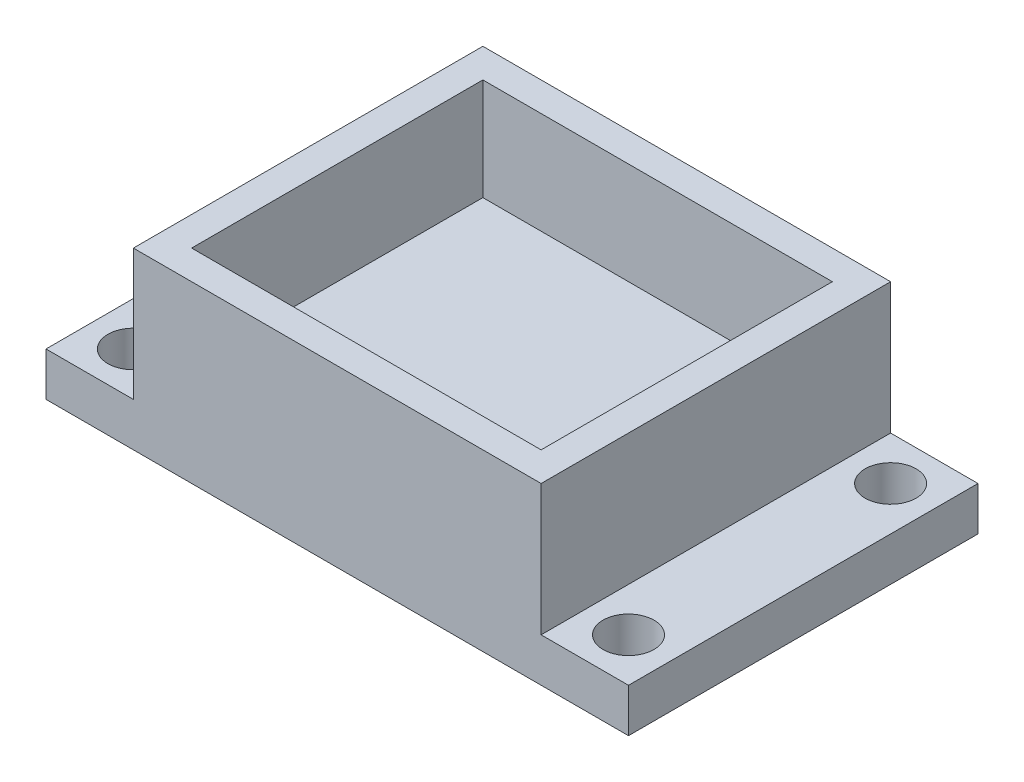
ISO-10303-21;
HEADER;
FILE_DESCRIPTION(('STEP AP214'),'2;1');
FILE_NAME('part.step','',(''),(''),'','','');
FILE_SCHEMA(('AUTOMOTIVE_DESIGN { 1 0 10303 214 1 1 1 1 }'));
ENDSEC;
DATA;
#1=APPLICATION_CONTEXT('core data for automotive mechanical design processes');
#2=APPLICATION_PROTOCOL_DEFINITION('international standard','automotive_design',2000,#1);
#3=PRODUCT_CONTEXT('',#1,'mechanical');
#4=PRODUCT('Part','Part','',(#3));
#5=PRODUCT_RELATED_PRODUCT_CATEGORY('part','',(#4));
#6=PRODUCT_DEFINITION_FORMATION('','',#4);
#7=PRODUCT_DEFINITION_CONTEXT('part definition',#1,'design');
#8=PRODUCT_DEFINITION('design','',#6,#7);
#9=PRODUCT_DEFINITION_SHAPE('','',#8);
#10=(LENGTH_UNIT() NAMED_UNIT(*) SI_UNIT(.MILLI.,.METRE.));
#11=(NAMED_UNIT(*) PLANE_ANGLE_UNIT() SI_UNIT($,.RADIAN.));
#12=(NAMED_UNIT(*) SI_UNIT($,.STERADIAN.) SOLID_ANGLE_UNIT());
#13=UNCERTAINTY_MEASURE_WITH_UNIT(LENGTH_MEASURE(1.E-05),#10,'distance_accuracy_value','');
#14=(GEOMETRIC_REPRESENTATION_CONTEXT(3) GLOBAL_UNCERTAINTY_ASSIGNED_CONTEXT((#13)) GLOBAL_UNIT_ASSIGNED_CONTEXT((#10,
#11,#12)) REPRESENTATION_CONTEXT('',''));
#15=CARTESIAN_POINT('',(0.,0.,0.));
#16=DIRECTION('',(0.,0.,1.));
#17=DIRECTION('',(1.,0.,0.));
#18=AXIS2_PLACEMENT_3D('',#15,#16,#17);
#19=CARTESIAN_POINT('',(9.5,5.,7.5));
#20=DIRECTION('',(0.,1.,0.));
#21=DIRECTION('',(0.,0.,1.));
#22=AXIS2_PLACEMENT_3D('',#19,#20,#21);
#23=CYLINDRICAL_SURFACE('',#22,1.15000000000001);
#24=CARTESIAN_POINT('',(9.5,5.,7.5));
#25=DIRECTION('',(0.,1.,0.));
#26=DIRECTION('',(0.,0.,1.));
#27=AXIS2_PLACEMENT_3D('',#24,#25,#26);
#28=CIRCLE('',#27,1.15000000000001);
#29=CARTESIAN_POINT('',(9.5,5.,8.65000000000001));
#30=VERTEX_POINT('',#29);
#31=EDGE_CURVE('E359',#30,#30,#28,.T.);
#32=ORIENTED_EDGE('',*,*,#31,.T.);
#33=EDGE_LOOP('',(#32));
#34=FACE_BOUND('',#33,.T.);
#35=CARTESIAN_POINT('',(9.5,3.2,7.5));
#36=DIRECTION('',(0.,-1.,0.));
#37=DIRECTION('',(0.,0.,-1.));
#38=AXIS2_PLACEMENT_3D('',#35,#36,#37);
#39=CIRCLE('',#38,1.15000000000001);
#40=CARTESIAN_POINT('',(9.5,3.2,6.34999999999999));
#41=VERTEX_POINT('',#40);
#42=EDGE_CURVE('E42',#41,#41,#39,.F.);
#43=ORIENTED_EDGE('',*,*,#42,.F.);
#44=EDGE_LOOP('',(#43));
#45=FACE_BOUND('',#44,.T.);
#46=ADVANCED_FACE('F38',(#34,#45),#23,.F.);
#47=CARTESIAN_POINT('',(9.5,5.,-7.5));
#48=DIRECTION('',(0.,1.,0.));
#49=DIRECTION('',(0.,0.,1.));
#50=AXIS2_PLACEMENT_3D('',#47,#48,#49);
#51=CYLINDRICAL_SURFACE('',#50,1.15000000000001);
#52=CARTESIAN_POINT('',(9.5,5.,-7.5));
#53=DIRECTION('',(0.,1.,0.));
#54=DIRECTION('',(0.,0.,1.));
#55=AXIS2_PLACEMENT_3D('',#52,#53,#54);
#56=CIRCLE('',#55,1.15000000000001);
#57=CARTESIAN_POINT('',(9.5,5.,-6.34999999999999));
#58=VERTEX_POINT('',#57);
#59=EDGE_CURVE('E350',#58,#58,#56,.T.);
#60=ORIENTED_EDGE('',*,*,#59,.T.);
#61=EDGE_LOOP('',(#60));
#62=FACE_BOUND('',#61,.T.);
#63=CARTESIAN_POINT('',(9.5,3.2,-7.5));
#64=DIRECTION('',(0.,-1.,0.));
#65=DIRECTION('',(0.,0.,-1.));
#66=AXIS2_PLACEMENT_3D('',#63,#64,#65);
#67=CIRCLE('',#66,1.15000000000001);
#68=CARTESIAN_POINT('',(9.5,3.2,-8.65000000000001));
#69=VERTEX_POINT('',#68);
#70=EDGE_CURVE('E273',#69,#69,#67,.F.);
#71=ORIENTED_EDGE('',*,*,#70,.F.);
#72=EDGE_LOOP('',(#71));
#73=FACE_BOUND('',#72,.T.);
#74=ADVANCED_FACE('F483',(#62,#73),#51,.F.);
#75=CARTESIAN_POINT('',(-20.,3.,-12.));
#76=DIRECTION('',(0.,-1.,0.));
#77=DIRECTION('',(0.,0.,-1.));
#78=AXIS2_PLACEMENT_3D('',#75,#76,#77);
#79=PLANE('',#78);
#80=DIRECTION('',(0.,0.,-1.));
#81=VECTOR('',#80,1.);
#82=CARTESIAN_POINT('',(-14.,3.,-12.));
#83=LINE('',#82,#81);
#84=CARTESIAN_POINT('',(-14.,3.,12.));
#85=VERTEX_POINT('',#84);
#86=CARTESIAN_POINT('',(-14.,3.,-12.));
#87=VERTEX_POINT('',#86);
#88=EDGE_CURVE('E405',#85,#87,#83,.T.);
#89=ORIENTED_EDGE('',*,*,#88,.T.);
#90=DIRECTION('',(1.,0.,0.));
#91=VECTOR('',#90,1.);
#92=CARTESIAN_POINT('',(-20.,3.,-12.));
#93=LINE('',#92,#91);
#94=CARTESIAN_POINT('',(-20.,3.,-12.));
#95=VERTEX_POINT('',#94);
#96=EDGE_CURVE('E416',#95,#87,#93,.T.);
#97=ORIENTED_EDGE('',*,*,#96,.F.);
#98=DIRECTION('',(0.,0.,-1.));
#99=VECTOR('',#98,1.);
#100=CARTESIAN_POINT('',(-20.,3.,-12.));
#101=LINE('',#100,#99);
#102=CARTESIAN_POINT('',(-20.,3.,12.));
#103=VERTEX_POINT('',#102);
#104=EDGE_CURVE('E414',#103,#95,#101,.T.);
#105=ORIENTED_EDGE('',*,*,#104,.F.);
#106=DIRECTION('',(1.,0.,0.));
#107=VECTOR('',#106,1.);
#108=CARTESIAN_POINT('',(-20.,3.,12.));
#109=LINE('',#108,#107);
#110=EDGE_CURVE('E421',#103,#85,#109,.T.);
#111=ORIENTED_EDGE('',*,*,#110,.T.);
#112=EDGE_LOOP('',(#89,#97,#105,#111));
#113=FACE_BOUND('',#112,.T.);
#114=CARTESIAN_POINT('',(-17.,3.,9.));
#115=DIRECTION('',(0.,1.,0.));
#116=DIRECTION('',(0.,0.,1.));
#117=AXIS2_PLACEMENT_3D('',#114,#115,#116);
#118=CIRCLE('',#117,1.75000000000001);
#119=CARTESIAN_POINT('',(-17.,3.,10.75));
#120=VERTEX_POINT('',#119);
#121=EDGE_CURVE('E399',#120,#120,#118,.T.);
#122=ORIENTED_EDGE('',*,*,#121,.F.);
#123=EDGE_LOOP('',(#122));
#124=FACE_BOUND('',#123,.T.);
#125=CARTESIAN_POINT('',(-17.,3.,-9.00000000000001));
#126=DIRECTION('',(0.,1.,0.));
#127=DIRECTION('',(0.,0.,1.));
#128=AXIS2_PLACEMENT_3D('',#125,#126,#127);
#129=CIRCLE('',#128,1.75000000000001);
#130=CARTESIAN_POINT('',(-17.,3.,-7.24999999999999));
#131=VERTEX_POINT('',#130);
#132=EDGE_CURVE('E393',#131,#131,#129,.T.);
#133=ORIENTED_EDGE('',*,*,#132,.F.);
#134=EDGE_LOOP('',(#133));
#135=FACE_BOUND('',#134,.T.);
#136=ADVANCED_FACE('F490',(#113,#124,#135),#79,.F.);
#137=CARTESIAN_POINT('',(-14.,12.,-12.));
#138=DIRECTION('',(1.,0.,0.));
#139=DIRECTION('',(0.,0.,-1.));
#140=AXIS2_PLACEMENT_3D('',#137,#138,#139);
#141=PLANE('',#140);
#142=ORIENTED_EDGE('',*,*,#88,.F.);
#143=DIRECTION('',(0.,-1.,0.));
#144=VECTOR('',#143,1.);
#145=CARTESIAN_POINT('',(-14.,12.,12.));
#146=LINE('',#145,#144);
#147=CARTESIAN_POINT('',(-14.,12.,12.));
#148=VERTEX_POINT('',#147);
#149=EDGE_CURVE('E473',#148,#85,#146,.T.);
#150=ORIENTED_EDGE('',*,*,#149,.F.);
#151=DIRECTION('',(0.,0.,1.));
#152=VECTOR('',#151,1.);
#153=CARTESIAN_POINT('',(-14.,12.,-12.));
#154=LINE('',#153,#152);
#155=CARTESIAN_POINT('',(-14.,12.,-12.));
#156=VERTEX_POINT('',#155);
#157=EDGE_CURVE('E464',#156,#148,#154,.T.);
#158=ORIENTED_EDGE('',*,*,#157,.F.);
#159=DIRECTION('',(0.,-1.,0.));
#160=VECTOR('',#159,1.);
#161=CARTESIAN_POINT('',(-14.,12.,-12.));
#162=LINE('',#161,#160);
#163=EDGE_CURVE('E47',#156,#87,#162,.T.);
#164=ORIENTED_EDGE('',*,*,#163,.T.);
#165=EDGE_LOOP('',(#142,#150,#158,#164));
#166=FACE_BOUND('',#165,.T.);
#167=ADVANCED_FACE('F527',(#166),#141,.F.);
#168=CARTESIAN_POINT('',(14.,12.,-12.));
#169=DIRECTION('',(-1.,0.,0.));
#170=DIRECTION('',(0.,0.,1.));
#171=AXIS2_PLACEMENT_3D('',#168,#169,#170);
#172=PLANE('',#171);
#173=DIRECTION('',(0.,-1.,0.));
#174=VECTOR('',#173,1.);
#175=CARTESIAN_POINT('',(14.,12.,12.));
#176=LINE('',#175,#174);
#177=CARTESIAN_POINT('',(14.,12.,12.));
#178=VERTEX_POINT('',#177);
#179=CARTESIAN_POINT('',(14.,3.,12.));
#180=VERTEX_POINT('',#179);
#181=EDGE_CURVE('E468',#178,#180,#176,.T.);
#182=ORIENTED_EDGE('',*,*,#181,.T.);
#183=DIRECTION('',(0.,0.,-1.));
#184=VECTOR('',#183,1.);
#185=CARTESIAN_POINT('',(14.,3.,-12.));
#186=LINE('',#185,#184);
#187=CARTESIAN_POINT('',(14.,3.,-12.));
#188=VERTEX_POINT('',#187);
#189=EDGE_CURVE('E374',#180,#188,#186,.T.);
#190=ORIENTED_EDGE('',*,*,#189,.T.);
#191=DIRECTION('',(0.,-1.,0.));
#192=VECTOR('',#191,1.);
#193=CARTESIAN_POINT('',(14.,12.,-12.));
#194=LINE('',#193,#192);
#195=CARTESIAN_POINT('',(14.,12.,-12.));
#196=VERTEX_POINT('',#195);
#197=EDGE_CURVE('E11',#196,#188,#194,.T.);
#198=ORIENTED_EDGE('',*,*,#197,.F.);
#199=DIRECTION('',(0.,0.,-1.));
#200=VECTOR('',#199,1.);
#201=CARTESIAN_POINT('',(14.,12.,-12.));
#202=LINE('',#201,#200);
#203=EDGE_CURVE('E458',#178,#196,#202,.T.);
#204=ORIENTED_EDGE('',*,*,#203,.F.);
#205=EDGE_LOOP('',(#182,#190,#198,#204));
#206=FACE_BOUND('',#205,.T.);
#207=ADVANCED_FACE('F40',(#206),#172,.F.);
#208=CARTESIAN_POINT('',(-14.,12.,-12.));
#209=DIRECTION('',(0.,0.,1.));
#210=DIRECTION('',(1.,0.,0.));
#211=AXIS2_PLACEMENT_3D('',#208,#209,#210);
#212=PLANE('',#211);
#213=DIRECTION('',(-1.,0.,0.));
#214=VECTOR('',#213,1.);
#215=CARTESIAN_POINT('',(-14.,0.,-12.));
#216=LINE('',#215,#214);
#217=CARTESIAN_POINT('',(20.,0.,-12.));
#218=VERTEX_POINT('',#217);
#219=CARTESIAN_POINT('',(-20.,0.,-12.));
#220=VERTEX_POINT('',#219);
#221=EDGE_CURVE('E451',#218,#220,#216,.T.);
#222=ORIENTED_EDGE('',*,*,#221,.T.);
#223=DIRECTION('',(0.,-1.,0.));
#224=VECTOR('',#223,1.);
#225=CARTESIAN_POINT('',(-20.,0.,-12.));
#226=LINE('',#225,#224);
#227=EDGE_CURVE('E406',#95,#220,#226,.T.);
#228=ORIENTED_EDGE('',*,*,#227,.F.);
#229=ORIENTED_EDGE('',*,*,#96,.T.);
#230=ORIENTED_EDGE('',*,*,#163,.F.);
#231=DIRECTION('',(-1.,0.,0.));
#232=VECTOR('',#231,1.);
#233=CARTESIAN_POINT('',(-14.,12.,-12.));
#234=LINE('',#233,#232);
#235=EDGE_CURVE('E461',#196,#156,#234,.T.);
#236=ORIENTED_EDGE('',*,*,#235,.F.);
#237=ORIENTED_EDGE('',*,*,#197,.T.);
#238=DIRECTION('',(-1.,0.,0.));
#239=VECTOR('',#238,1.);
#240=CARTESIAN_POINT('',(20.,3.,-12.));
#241=LINE('',#240,#239);
#242=CARTESIAN_POINT('',(20.,3.,-12.));
#243=VERTEX_POINT('',#242);
#244=EDGE_CURVE('E391',#243,#188,#241,.T.);
#245=ORIENTED_EDGE('',*,*,#244,.F.);
#246=DIRECTION('',(0.,-1.,0.));
#247=VECTOR('',#246,1.);
#248=CARTESIAN_POINT('',(20.,0.,-12.));
#249=LINE('',#248,#247);
#250=EDGE_CURVE('E375',#243,#218,#249,.T.);
#251=ORIENTED_EDGE('',*,*,#250,.T.);
#252=EDGE_LOOP('',(#222,#228,#229,#230,#236,#237,#245,#251));
#253=FACE_BOUND('',#252,.T.);
#254=ADVANCED_FACE('F559',(#253),#212,.F.);
#255=CARTESIAN_POINT('',(-14.,12.,12.));
#256=DIRECTION('',(0.,0.,-1.));
#257=DIRECTION('',(-1.,0.,0.));
#258=AXIS2_PLACEMENT_3D('',#255,#256,#257);
#259=PLANE('',#258);
#260=DIRECTION('',(1.,0.,0.));
#261=VECTOR('',#260,1.);
#262=CARTESIAN_POINT('',(-14.,0.,12.));
#263=LINE('',#262,#261);
#264=CARTESIAN_POINT('',(-20.,0.,12.));
#265=VERTEX_POINT('',#264);
#266=CARTESIAN_POINT('',(20.,0.,12.));
#267=VERTEX_POINT('',#266);
#268=EDGE_CURVE('E462',#265,#267,#263,.T.);
#269=ORIENTED_EDGE('',*,*,#268,.T.);
#270=DIRECTION('',(0.,1.,0.));
#271=VECTOR('',#270,1.);
#272=CARTESIAN_POINT('',(20.,0.,12.));
#273=LINE('',#272,#271);
#274=CARTESIAN_POINT('',(20.,3.,12.));
#275=VERTEX_POINT('',#274);
#276=EDGE_CURVE('E381',#267,#275,#273,.T.);
#277=ORIENTED_EDGE('',*,*,#276,.T.);
#278=DIRECTION('',(-1.,0.,0.));
#279=VECTOR('',#278,1.);
#280=CARTESIAN_POINT('',(20.,3.,12.));
#281=LINE('',#280,#279);
#282=EDGE_CURVE('E387',#275,#180,#281,.T.);
#283=ORIENTED_EDGE('',*,*,#282,.T.);
#284=ORIENTED_EDGE('',*,*,#181,.F.);
#285=DIRECTION('',(1.,0.,0.));
#286=VECTOR('',#285,1.);
#287=CARTESIAN_POINT('',(-14.,12.,12.));
#288=LINE('',#287,#286);
#289=EDGE_CURVE('E466',#148,#178,#288,.T.);
#290=ORIENTED_EDGE('',*,*,#289,.F.);
#291=ORIENTED_EDGE('',*,*,#149,.T.);
#292=ORIENTED_EDGE('',*,*,#110,.F.);
#293=DIRECTION('',(0.,1.,0.));
#294=VECTOR('',#293,1.);
#295=CARTESIAN_POINT('',(-20.,0.,12.));
#296=LINE('',#295,#294);
#297=EDGE_CURVE('E412',#265,#103,#296,.T.);
#298=ORIENTED_EDGE('',*,*,#297,.F.);
#299=EDGE_LOOP('',(#269,#277,#283,#284,#290,#291,#292,#298));
#300=FACE_BOUND('',#299,.T.);
#301=ADVANCED_FACE('F552',(#300),#259,.F.);
#302=CARTESIAN_POINT('',(0.,12.,0.));
#303=DIRECTION('',(0.,1.,0.));
#304=DIRECTION('',(0.,0.,1.));
#305=AXIS2_PLACEMENT_3D('',#302,#303,#304);
#306=PLANE('',#305);
#307=DIRECTION('',(0.,0.,-1.));
#308=VECTOR('',#307,1.);
#309=CARTESIAN_POINT('',(12.,12.,-10.));
#310=LINE('',#309,#308);
#311=CARTESIAN_POINT('',(12.,12.,10.));
#312=VERTEX_POINT('',#311);
#313=CARTESIAN_POINT('',(12.,12.,-10.));
#314=VERTEX_POINT('',#313);
#315=EDGE_CURVE('E424',#312,#314,#310,.T.);
#316=ORIENTED_EDGE('',*,*,#315,.F.);
#317=DIRECTION('',(1.,0.,0.));
#318=VECTOR('',#317,1.);
#319=CARTESIAN_POINT('',(-12.,12.,10.));
#320=LINE('',#319,#318);
#321=CARTESIAN_POINT('',(-12.,12.,10.));
#322=VERTEX_POINT('',#321);
#323=EDGE_CURVE('E446',#322,#312,#320,.T.);
#324=ORIENTED_EDGE('',*,*,#323,.F.);
#325=DIRECTION('',(0.,0.,1.));
#326=VECTOR('',#325,1.);
#327=CARTESIAN_POINT('',(-12.,12.,-10.));
#328=LINE('',#327,#326);
#329=CARTESIAN_POINT('',(-12.,12.,-10.));
#330=VERTEX_POINT('',#329);
#331=EDGE_CURVE('E443',#330,#322,#328,.T.);
#332=ORIENTED_EDGE('',*,*,#331,.F.);
#333=DIRECTION('',(-1.,0.,0.));
#334=VECTOR('',#333,1.);
#335=CARTESIAN_POINT('',(-12.,12.,-10.));
#336=LINE('',#335,#334);
#337=EDGE_CURVE('E440',#314,#330,#336,.T.);
#338=ORIENTED_EDGE('',*,*,#337,.F.);
#339=EDGE_LOOP('',(#316,#324,#332,#338));
#340=FACE_BOUND('',#339,.T.);
#341=ORIENTED_EDGE('',*,*,#203,.T.);
#342=ORIENTED_EDGE('',*,*,#235,.T.);
#343=ORIENTED_EDGE('',*,*,#157,.T.);
#344=ORIENTED_EDGE('',*,*,#289,.T.);
#345=EDGE_LOOP('',(#341,#342,#343,#344));
#346=FACE_BOUND('',#345,.T.);
#347=ADVANCED_FACE('F549',(#340,#346),#306,.T.);
#348=CARTESIAN_POINT('',(0.,0.,0.));
#349=DIRECTION('',(0.,1.,0.));
#350=DIRECTION('',(0.,0.,1.));
#351=AXIS2_PLACEMENT_3D('',#348,#349,#350);
#352=PLANE('',#351);
#353=DIRECTION('',(-0.5,0.,0.866025403784439));
#354=VECTOR('',#353,1.);
#355=CARTESIAN_POINT('',(11.9248711305964,0.,7.5));
#356=LINE('',#355,#354);
#357=CARTESIAN_POINT('',(11.9248711305964,0.,7.5));
#358=VERTEX_POINT('',#357);
#359=CARTESIAN_POINT('',(10.7124355652982,0.,9.6));
#360=VERTEX_POINT('',#359);
#361=EDGE_CURVE('E261',#358,#360,#356,.T.);
#362=ORIENTED_EDGE('',*,*,#361,.F.);
#363=DIRECTION('',(0.5,0.,0.866025403784439));
#364=VECTOR('',#363,1.);
#365=CARTESIAN_POINT('',(10.7124355652982,0.,5.4));
#366=LINE('',#365,#364);
#367=CARTESIAN_POINT('',(10.7124355652982,0.,5.4));
#368=VERTEX_POINT('',#367);
#369=EDGE_CURVE('E55',#368,#358,#366,.T.);
#370=ORIENTED_EDGE('',*,*,#369,.F.);
#371=DIRECTION('',(1.,0.,0.));
#372=VECTOR('',#371,1.);
#373=CARTESIAN_POINT('',(8.28756443470179,0.,5.4));
#374=LINE('',#373,#372);
#375=CARTESIAN_POINT('',(8.28756443470179,0.,5.4));
#376=VERTEX_POINT('',#375);
#377=EDGE_CURVE('E247',#376,#368,#374,.T.);
#378=ORIENTED_EDGE('',*,*,#377,.F.);
#379=DIRECTION('',(0.5,0.,-0.866025403784439));
#380=VECTOR('',#379,1.);
#381=CARTESIAN_POINT('',(7.07512886940357,0.,7.5));
#382=LINE('',#381,#380);
#383=CARTESIAN_POINT('',(7.07512886940357,0.,7.5));
#384=VERTEX_POINT('',#383);
#385=EDGE_CURVE('E250',#384,#376,#382,.T.);
#386=ORIENTED_EDGE('',*,*,#385,.F.);
#387=DIRECTION('',(-0.5,0.,-0.866025403784439));
#388=VECTOR('',#387,1.);
#389=CARTESIAN_POINT('',(8.28756443470179,0.,9.6));
#390=LINE('',#389,#388);
#391=CARTESIAN_POINT('',(8.28756443470179,0.,9.6));
#392=VERTEX_POINT('',#391);
#393=EDGE_CURVE('E266',#392,#384,#390,.T.);
#394=ORIENTED_EDGE('',*,*,#393,.F.);
#395=DIRECTION('',(-1.,0.,0.));
#396=VECTOR('',#395,1.);
#397=CARTESIAN_POINT('',(10.7124355652982,0.,9.6));
#398=LINE('',#397,#396);
#399=EDGE_CURVE('E263',#360,#392,#398,.T.);
#400=ORIENTED_EDGE('',*,*,#399,.F.);
#401=EDGE_LOOP('',(#362,#370,#378,#386,#394,#400));
#402=FACE_BOUND('',#401,.T.);
#403=DIRECTION('',(-0.499999999999999,0.,0.866025403784439));
#404=VECTOR('',#403,1.);
#405=CARTESIAN_POINT('',(11.9248711305964,0.,-7.5));
#406=LINE('',#405,#404);
#407=CARTESIAN_POINT('',(11.9248711305964,0.,-7.5));
#408=VERTEX_POINT('',#407);
#409=CARTESIAN_POINT('',(10.7124355652982,0.,-5.4));
#410=VERTEX_POINT('',#409);
#411=EDGE_CURVE('E307',#408,#410,#406,.T.);
#412=ORIENTED_EDGE('',*,*,#411,.F.);
#413=DIRECTION('',(0.5,0.,0.866025403784439));
#414=VECTOR('',#413,1.);
#415=CARTESIAN_POINT('',(10.7124355652982,0.,-9.6));
#416=LINE('',#415,#414);
#417=CARTESIAN_POINT('',(10.7124355652982,0.,-9.6));
#418=VERTEX_POINT('',#417);
#419=EDGE_CURVE('E63',#418,#408,#416,.T.);
#420=ORIENTED_EDGE('',*,*,#419,.F.);
#421=DIRECTION('',(1.,0.,0.));
#422=VECTOR('',#421,1.);
#423=CARTESIAN_POINT('',(8.28756443470179,0.,-9.6));
#424=LINE('',#423,#422);
#425=CARTESIAN_POINT('',(8.28756443470179,0.,-9.6));
#426=VERTEX_POINT('',#425);
#427=EDGE_CURVE('E294',#426,#418,#424,.T.);
#428=ORIENTED_EDGE('',*,*,#427,.F.);
#429=DIRECTION('',(0.5,0.,-0.866025403784439));
#430=VECTOR('',#429,1.);
#431=CARTESIAN_POINT('',(7.07512886940357,0.,-7.5));
#432=LINE('',#431,#430);
#433=CARTESIAN_POINT('',(7.07512886940357,0.,-7.5));
#434=VERTEX_POINT('',#433);
#435=EDGE_CURVE('E297',#434,#426,#432,.T.);
#436=ORIENTED_EDGE('',*,*,#435,.F.);
#437=DIRECTION('',(-0.5,0.,-0.866025403784439));
#438=VECTOR('',#437,1.);
#439=CARTESIAN_POINT('',(8.28756443470178,0.,-5.4));
#440=LINE('',#439,#438);
#441=CARTESIAN_POINT('',(8.28756443470178,0.,-5.4));
#442=VERTEX_POINT('',#441);
#443=EDGE_CURVE('E301',#442,#434,#440,.T.);
#444=ORIENTED_EDGE('',*,*,#443,.F.);
#445=DIRECTION('',(-1.,0.,0.));
#446=VECTOR('',#445,1.);
#447=CARTESIAN_POINT('',(10.7124355652982,0.,-5.4));
#448=LINE('',#447,#446);
#449=EDGE_CURVE('E304',#410,#442,#448,.T.);
#450=ORIENTED_EDGE('',*,*,#449,.F.);
#451=EDGE_LOOP('',(#412,#420,#428,#436,#444,#450));
#452=FACE_BOUND('',#451,.T.);
#453=CARTESIAN_POINT('',(17.,0.,-9.00000000000001));
#454=DIRECTION('',(0.,1.,0.));
#455=DIRECTION('',(0.,0.,1.));
#456=AXIS2_PLACEMENT_3D('',#453,#454,#455);
#457=CIRCLE('',#456,1.75000000000001);
#458=CARTESIAN_POINT('',(17.,0.,-7.25));
#459=VERTEX_POINT('',#458);
#460=EDGE_CURVE('E365',#459,#459,#457,.T.);
#461=ORIENTED_EDGE('',*,*,#460,.T.);
#462=EDGE_LOOP('',(#461));
#463=FACE_BOUND('',#462,.T.);
#464=CARTESIAN_POINT('',(17.,0.,8.99999999999999));
#465=DIRECTION('',(0.,1.,0.));
#466=DIRECTION('',(0.,0.,1.));
#467=AXIS2_PLACEMENT_3D('',#464,#465,#466);
#468=CIRCLE('',#467,1.75000000000001);
#469=CARTESIAN_POINT('',(17.,0.,10.75));
#470=VERTEX_POINT('',#469);
#471=EDGE_CURVE('E371',#470,#470,#468,.T.);
#472=ORIENTED_EDGE('',*,*,#471,.T.);
#473=EDGE_LOOP('',(#472));
#474=FACE_BOUND('',#473,.T.);
#475=CARTESIAN_POINT('',(-17.,0.,-9.00000000000001));
#476=DIRECTION('',(0.,1.,0.));
#477=DIRECTION('',(0.,0.,1.));
#478=AXIS2_PLACEMENT_3D('',#475,#476,#477);
#479=CIRCLE('',#478,1.75000000000001);
#480=CARTESIAN_POINT('',(-17.,0.,-7.24999999999999));
#481=VERTEX_POINT('',#480);
#482=EDGE_CURVE('E396',#481,#481,#479,.T.);
#483=ORIENTED_EDGE('',*,*,#482,.T.);
#484=EDGE_LOOP('',(#483));
#485=FACE_BOUND('',#484,.T.);
#486=CARTESIAN_POINT('',(-17.,0.,9.));
#487=DIRECTION('',(0.,1.,0.));
#488=DIRECTION('',(0.,0.,1.));
#489=AXIS2_PLACEMENT_3D('',#486,#487,#488);
#490=CIRCLE('',#489,1.75000000000001);
#491=CARTESIAN_POINT('',(-17.,0.,10.75));
#492=VERTEX_POINT('',#491);
#493=EDGE_CURVE('E402',#492,#492,#490,.T.);
#494=ORIENTED_EDGE('',*,*,#493,.T.);
#495=EDGE_LOOP('',(#494));
#496=FACE_BOUND('',#495,.T.);
#497=ORIENTED_EDGE('',*,*,#221,.F.);
#498=DIRECTION('',(0.,0.,1.));
#499=VECTOR('',#498,1.);
#500=CARTESIAN_POINT('',(20.,0.,-12.));
#501=LINE('',#500,#499);
#502=EDGE_CURVE('E384',#218,#267,#501,.T.);
#503=ORIENTED_EDGE('',*,*,#502,.T.);
#504=ORIENTED_EDGE('',*,*,#268,.F.);
#505=DIRECTION('',(0.,0.,1.));
#506=VECTOR('',#505,1.);
#507=CARTESIAN_POINT('',(-20.,0.,-12.));
#508=LINE('',#507,#506);
#509=EDGE_CURVE('E409',#220,#265,#508,.T.);
#510=ORIENTED_EDGE('',*,*,#509,.F.);
#511=EDGE_LOOP('',(#497,#503,#504,#510));
#512=FACE_BOUND('',#511,.T.);
#513=ADVANCED_FACE('F547',(#402,#452,#463,#474,#485,#496,#512),#352,.F.);
#514=CARTESIAN_POINT('',(12.,5.,-10.));
#515=DIRECTION('',(1.,0.,0.));
#516=DIRECTION('',(0.,0.,-1.));
#517=AXIS2_PLACEMENT_3D('',#514,#515,#516);
#518=PLANE('',#517);
#519=ORIENTED_EDGE('',*,*,#315,.T.);
#520=DIRECTION('',(0.,1.,0.));
#521=VECTOR('',#520,1.);
#522=CARTESIAN_POINT('',(12.,5.,-10.));
#523=LINE('',#522,#521);
#524=CARTESIAN_POINT('',(12.,5.,-10.));
#525=VERTEX_POINT('',#524);
#526=EDGE_CURVE('E438',#525,#314,#523,.T.);
#527=ORIENTED_EDGE('',*,*,#526,.F.);
#528=DIRECTION('',(0.,0.,-1.));
#529=VECTOR('',#528,1.);
#530=CARTESIAN_POINT('',(12.,5.,-10.));
#531=LINE('',#530,#529);
#532=CARTESIAN_POINT('',(12.,5.,-3.5));
#533=VERTEX_POINT('',#532);
#534=EDGE_CURVE('E429',#533,#525,#531,.T.);
#535=ORIENTED_EDGE('',*,*,#534,.F.);
#536=DIRECTION('',(0.,1.,0.));
#537=VECTOR('',#536,1.);
#538=CARTESIAN_POINT('',(12.,4.,-3.5));
#539=LINE('',#538,#537);
#540=CARTESIAN_POINT('',(12.,4.,-3.5));
#541=VERTEX_POINT('',#540);
#542=EDGE_CURVE('E351',#541,#533,#539,.T.);
#543=ORIENTED_EDGE('',*,*,#542,.F.);
#544=DIRECTION('',(0.,0.,-1.));
#545=VECTOR('',#544,1.);
#546=CARTESIAN_POINT('',(12.,4.,-3.5));
#547=LINE('',#546,#545);
#548=CARTESIAN_POINT('',(12.,4.,3.5));
#549=VERTEX_POINT('',#548);
#550=EDGE_CURVE('E334',#549,#541,#547,.T.);
#551=ORIENTED_EDGE('',*,*,#550,.F.);
#552=DIRECTION('',(0.,1.,0.));
#553=VECTOR('',#552,1.);
#554=CARTESIAN_POINT('',(12.,4.,3.5));
#555=LINE('',#554,#553);
#556=CARTESIAN_POINT('',(12.,5.,3.5));
#557=VERTEX_POINT('',#556);
#558=EDGE_CURVE('E353',#549,#557,#555,.T.);
#559=ORIENTED_EDGE('',*,*,#558,.T.);
#560=CARTESIAN_POINT('',(12.,5.,10.));
#561=VERTEX_POINT('',#560);
#562=EDGE_CURVE('E425',#561,#557,#531,.T.);
#563=ORIENTED_EDGE('',*,*,#562,.F.);
#564=DIRECTION('',(0.,1.,0.));
#565=VECTOR('',#564,1.);
#566=CARTESIAN_POINT('',(12.,5.,10.));
#567=LINE('',#566,#565);
#568=EDGE_CURVE('E449',#561,#312,#567,.T.);
#569=ORIENTED_EDGE('',*,*,#568,.T.);
#570=EDGE_LOOP('',(#519,#527,#535,#543,#551,#559,#563,#569));
#571=FACE_BOUND('',#570,.T.);
#572=ADVANCED_FACE('F537',(#571),#518,.F.);
#573=CARTESIAN_POINT('',(-12.,5.,10.));
#574=DIRECTION('',(0.,0.,1.));
#575=DIRECTION('',(1.,0.,0.));
#576=AXIS2_PLACEMENT_3D('',#573,#574,#575);
#577=PLANE('',#576);
#578=ORIENTED_EDGE('',*,*,#323,.T.);
#579=ORIENTED_EDGE('',*,*,#568,.F.);
#580=DIRECTION('',(1.,0.,0.));
#581=VECTOR('',#580,1.);
#582=CARTESIAN_POINT('',(-12.,5.,10.));
#583=LINE('',#582,#581);
#584=CARTESIAN_POINT('',(-12.,5.,10.));
#585=VERTEX_POINT('',#584);
#586=EDGE_CURVE('E435',#585,#561,#583,.T.);
#587=ORIENTED_EDGE('',*,*,#586,.F.);
#588=DIRECTION('',(0.,1.,0.));
#589=VECTOR('',#588,1.);
#590=CARTESIAN_POINT('',(-12.,5.,10.));
#591=LINE('',#590,#589);
#592=EDGE_CURVE('E452',#585,#322,#591,.T.);
#593=ORIENTED_EDGE('',*,*,#592,.T.);
#594=EDGE_LOOP('',(#578,#579,#587,#593));
#595=FACE_BOUND('',#594,.T.);
#596=ADVANCED_FACE('F533',(#595),#577,.F.);
#597=CARTESIAN_POINT('',(-12.,5.,-10.));
#598=DIRECTION('',(-1.,0.,0.));
#599=DIRECTION('',(0.,0.,1.));
#600=AXIS2_PLACEMENT_3D('',#597,#598,#599);
#601=PLANE('',#600);
#602=ORIENTED_EDGE('',*,*,#331,.T.);
#603=ORIENTED_EDGE('',*,*,#592,.F.);
#604=DIRECTION('',(0.,0.,1.));
#605=VECTOR('',#604,1.);
#606=CARTESIAN_POINT('',(-12.,5.,-10.));
#607=LINE('',#606,#605);
#608=CARTESIAN_POINT('',(-12.,5.,-10.));
#609=VERTEX_POINT('',#608);
#610=EDGE_CURVE('E432',#609,#585,#607,.T.);
#611=ORIENTED_EDGE('',*,*,#610,.F.);
#612=DIRECTION('',(0.,1.,0.));
#613=VECTOR('',#612,1.);
#614=CARTESIAN_POINT('',(-12.,5.,-10.));
#615=LINE('',#614,#613);
#616=EDGE_CURVE('E454',#609,#330,#615,.T.);
#617=ORIENTED_EDGE('',*,*,#616,.T.);
#618=EDGE_LOOP('',(#602,#603,#611,#617));
#619=FACE_BOUND('',#618,.T.);
#620=ADVANCED_FACE('F536',(#619),#601,.F.);
#621=CARTESIAN_POINT('',(-12.,5.,-10.));
#622=DIRECTION('',(0.,0.,-1.));
#623=DIRECTION('',(-1.,0.,0.));
#624=AXIS2_PLACEMENT_3D('',#621,#622,#623);
#625=PLANE('',#624);
#626=ORIENTED_EDGE('',*,*,#337,.T.);
#627=ORIENTED_EDGE('',*,*,#616,.F.);
#628=DIRECTION('',(-1.,0.,0.));
#629=VECTOR('',#628,1.);
#630=CARTESIAN_POINT('',(-12.,5.,-10.));
#631=LINE('',#630,#629);
#632=EDGE_CURVE('E428',#525,#609,#631,.T.);
#633=ORIENTED_EDGE('',*,*,#632,.F.);
#634=ORIENTED_EDGE('',*,*,#526,.T.);
#635=EDGE_LOOP('',(#626,#627,#633,#634));
#636=FACE_BOUND('',#635,.T.);
#637=ADVANCED_FACE('F531',(#636),#625,.F.);
#638=CARTESIAN_POINT('',(0.,5.,0.));
#639=DIRECTION('',(0.,1.,0.));
#640=DIRECTION('',(0.,0.,1.));
#641=AXIS2_PLACEMENT_3D('',#638,#639,#640);
#642=PLANE('',#641);
#643=DIRECTION('',(-1.,0.,0.));
#644=VECTOR('',#643,1.);
#645=CARTESIAN_POINT('',(9.5,5.,-3.5));
#646=LINE('',#645,#644);
#647=CARTESIAN_POINT('',(9.5,5.,-3.5));
#648=VERTEX_POINT('',#647);
#649=EDGE_CURVE('E331',#533,#648,#646,.T.);
#650=ORIENTED_EDGE('',*,*,#649,.F.);
#651=ORIENTED_EDGE('',*,*,#534,.T.);
#652=ORIENTED_EDGE('',*,*,#632,.T.);
#653=ORIENTED_EDGE('',*,*,#610,.T.);
#654=ORIENTED_EDGE('',*,*,#586,.T.);
#655=ORIENTED_EDGE('',*,*,#562,.T.);
#656=DIRECTION('',(1.,0.,0.));
#657=VECTOR('',#656,1.);
#658=CARTESIAN_POINT('',(9.5,5.,3.5));
#659=LINE('',#658,#657);
#660=CARTESIAN_POINT('',(9.5,5.,3.5));
#661=VERTEX_POINT('',#660);
#662=EDGE_CURVE('E343',#661,#557,#659,.T.);
#663=ORIENTED_EDGE('',*,*,#662,.F.);
#664=DIRECTION('',(0.,0.,1.));
#665=VECTOR('',#664,1.);
#666=CARTESIAN_POINT('',(9.5,5.,-3.5));
#667=LINE('',#666,#665);
#668=EDGE_CURVE('E341',#648,#661,#667,.T.);
#669=ORIENTED_EDGE('',*,*,#668,.F.);
#670=EDGE_LOOP('',(#650,#651,#652,#653,#654,#655,#663,#669));
#671=FACE_BOUND('',#670,.T.);
#672=ORIENTED_EDGE('',*,*,#59,.F.);
#673=EDGE_LOOP('',(#672));
#674=FACE_BOUND('',#673,.T.);
#675=ORIENTED_EDGE('',*,*,#31,.F.);
#676=EDGE_LOOP('',(#675));
#677=FACE_BOUND('',#676,.T.);
#678=ADVANCED_FACE('F523',(#671,#674,#677),#642,.T.);
#679=CARTESIAN_POINT('',(-20.,0.,0.));
#680=DIRECTION('',(1.,0.,0.));
#681=DIRECTION('',(0.,0.,-1.));
#682=AXIS2_PLACEMENT_3D('',#679,#680,#681);
#683=PLANE('',#682);
#684=ORIENTED_EDGE('',*,*,#227,.T.);
#685=ORIENTED_EDGE('',*,*,#509,.T.);
#686=ORIENTED_EDGE('',*,*,#297,.T.);
#687=ORIENTED_EDGE('',*,*,#104,.T.);
#688=EDGE_LOOP('',(#684,#685,#686,#687));
#689=FACE_BOUND('',#688,.T.);
#690=ADVANCED_FACE('F519',(#689),#683,.F.);
#691=CARTESIAN_POINT('',(-17.,3.,9.));
#692=DIRECTION('',(0.,1.,0.));
#693=DIRECTION('',(0.,0.,1.));
#694=AXIS2_PLACEMENT_3D('',#691,#692,#693);
#695=CYLINDRICAL_SURFACE('',#694,1.75000000000001);
#696=ORIENTED_EDGE('',*,*,#493,.F.);
#697=EDGE_LOOP('',(#696));
#698=FACE_BOUND('',#697,.T.);
#699=ORIENTED_EDGE('',*,*,#121,.T.);
#700=EDGE_LOOP('',(#699));
#701=FACE_BOUND('',#700,.T.);
#702=ADVANCED_FACE('F515',(#698,#701),#695,.F.);
#703=CARTESIAN_POINT('',(-17.,3.,-9.00000000000001));
#704=DIRECTION('',(0.,1.,0.));
#705=DIRECTION('',(0.,0.,1.));
#706=AXIS2_PLACEMENT_3D('',#703,#704,#705);
#707=CYLINDRICAL_SURFACE('',#706,1.75000000000001);
#708=ORIENTED_EDGE('',*,*,#482,.F.);
#709=EDGE_LOOP('',(#708));
#710=FACE_BOUND('',#709,.T.);
#711=ORIENTED_EDGE('',*,*,#132,.T.);
#712=EDGE_LOOP('',(#711));
#713=FACE_BOUND('',#712,.T.);
#714=ADVANCED_FACE('F511',(#710,#713),#707,.F.);
#715=CARTESIAN_POINT('',(20.,3.,-12.));
#716=DIRECTION('',(0.,1.,0.));
#717=DIRECTION('',(0.,0.,1.));
#718=AXIS2_PLACEMENT_3D('',#715,#716,#717);
#719=PLANE('',#718);
#720=CARTESIAN_POINT('',(17.,3.,-9.00000000000001));
#721=DIRECTION('',(0.,1.,0.));
#722=DIRECTION('',(0.,0.,1.));
#723=AXIS2_PLACEMENT_3D('',#720,#721,#722);
#724=CIRCLE('',#723,1.75000000000002);
#725=CARTESIAN_POINT('',(17.,3.,-7.25));
#726=VERTEX_POINT('',#725);
#727=EDGE_CURVE('E362',#726,#726,#724,.T.);
#728=ORIENTED_EDGE('',*,*,#727,.F.);
#729=EDGE_LOOP('',(#728));
#730=FACE_BOUND('',#729,.T.);
#731=CARTESIAN_POINT('',(17.,3.,8.99999999999999));
#732=DIRECTION('',(0.,1.,0.));
#733=DIRECTION('',(0.,0.,1.));
#734=AXIS2_PLACEMENT_3D('',#731,#732,#733);
#735=CIRCLE('',#734,1.75000000000002);
#736=CARTESIAN_POINT('',(17.,3.,10.75));
#737=VERTEX_POINT('',#736);
#738=EDGE_CURVE('E368',#737,#737,#735,.T.);
#739=ORIENTED_EDGE('',*,*,#738,.F.);
#740=EDGE_LOOP('',(#739));
#741=FACE_BOUND('',#740,.T.);
#742=ORIENTED_EDGE('',*,*,#189,.F.);
#743=ORIENTED_EDGE('',*,*,#282,.F.);
#744=DIRECTION('',(0.,0.,-1.));
#745=VECTOR('',#744,1.);
#746=CARTESIAN_POINT('',(20.,3.,-12.));
#747=LINE('',#746,#745);
#748=EDGE_CURVE('E378',#275,#243,#747,.T.);
#749=ORIENTED_EDGE('',*,*,#748,.T.);
#750=ORIENTED_EDGE('',*,*,#244,.T.);
#751=EDGE_LOOP('',(#742,#743,#749,#750));
#752=FACE_BOUND('',#751,.T.);
#753=ADVANCED_FACE('F507',(#730,#741,#752),#719,.T.);
#754=CARTESIAN_POINT('',(20.,0.,0.));
#755=DIRECTION('',(-1.,0.,0.));
#756=DIRECTION('',(0.,0.,-1.));
#757=AXIS2_PLACEMENT_3D('',#754,#755,#756);
#758=PLANE('',#757);
#759=ORIENTED_EDGE('',*,*,#250,.F.);
#760=ORIENTED_EDGE('',*,*,#748,.F.);
#761=ORIENTED_EDGE('',*,*,#276,.F.);
#762=ORIENTED_EDGE('',*,*,#502,.F.);
#763=EDGE_LOOP('',(#759,#760,#761,#762));
#764=FACE_BOUND('',#763,.T.);
#765=ADVANCED_FACE('F503',(#764),#758,.F.);
#766=CARTESIAN_POINT('',(17.,3.,8.99999999999999));
#767=DIRECTION('',(0.,1.,0.));
#768=DIRECTION('',(0.,0.,1.));
#769=AXIS2_PLACEMENT_3D('',#766,#767,#768);
#770=CYLINDRICAL_SURFACE('',#769,1.75000000000001);
#771=ORIENTED_EDGE('',*,*,#471,.F.);
#772=EDGE_LOOP('',(#771));
#773=FACE_BOUND('',#772,.T.);
#774=ORIENTED_EDGE('',*,*,#738,.T.);
#775=EDGE_LOOP('',(#774));
#776=FACE_BOUND('',#775,.T.);
#777=ADVANCED_FACE('F499',(#773,#776),#770,.F.);
#778=CARTESIAN_POINT('',(17.,3.,-9.00000000000001));
#779=DIRECTION('',(0.,1.,0.));
#780=DIRECTION('',(0.,0.,1.));
#781=AXIS2_PLACEMENT_3D('',#778,#779,#780);
#782=CYLINDRICAL_SURFACE('',#781,1.75000000000001);
#783=ORIENTED_EDGE('',*,*,#460,.F.);
#784=EDGE_LOOP('',(#783));
#785=FACE_BOUND('',#784,.T.);
#786=ORIENTED_EDGE('',*,*,#727,.T.);
#787=EDGE_LOOP('',(#786));
#788=FACE_BOUND('',#787,.T.);
#789=ADVANCED_FACE('F495',(#785,#788),#782,.F.);
#790=CARTESIAN_POINT('',(9.5,4.,-3.5));
#791=DIRECTION('',(-1.,0.,0.));
#792=DIRECTION('',(0.,0.,1.));
#793=AXIS2_PLACEMENT_3D('',#790,#791,#792);
#794=PLANE('',#793);
#795=ORIENTED_EDGE('',*,*,#668,.T.);
#796=DIRECTION('',(0.,1.,0.));
#797=VECTOR('',#796,1.);
#798=CARTESIAN_POINT('',(9.5,4.,3.5));
#799=LINE('',#798,#797);
#800=CARTESIAN_POINT('',(9.5,4.,3.5));
#801=VERTEX_POINT('',#800);
#802=EDGE_CURVE('E340',#801,#661,#799,.T.);
#803=ORIENTED_EDGE('',*,*,#802,.F.);
#804=DIRECTION('',(0.,0.,1.));
#805=VECTOR('',#804,1.);
#806=CARTESIAN_POINT('',(9.5,4.,-3.5));
#807=LINE('',#806,#805);
#808=CARTESIAN_POINT('',(9.5,4.,-3.5));
#809=VERTEX_POINT('',#808);
#810=EDGE_CURVE('E327',#809,#801,#807,.T.);
#811=ORIENTED_EDGE('',*,*,#810,.F.);
#812=DIRECTION('',(0.,1.,0.));
#813=VECTOR('',#812,1.);
#814=CARTESIAN_POINT('',(9.5,4.,-3.5));
#815=LINE('',#814,#813);
#816=EDGE_CURVE('E348',#809,#648,#815,.T.);
#817=ORIENTED_EDGE('',*,*,#816,.T.);
#818=EDGE_LOOP('',(#795,#803,#811,#817));
#819=FACE_BOUND('',#818,.T.);
#820=ADVANCED_FACE('F498',(#819),#794,.F.);
#821=CARTESIAN_POINT('',(9.5,4.,-3.5));
#822=DIRECTION('',(0.,0.,-1.));
#823=DIRECTION('',(-1.,0.,0.));
#824=AXIS2_PLACEMENT_3D('',#821,#822,#823);
#825=PLANE('',#824);
#826=ORIENTED_EDGE('',*,*,#649,.T.);
#827=ORIENTED_EDGE('',*,*,#816,.F.);
#828=DIRECTION('',(-1.,0.,0.));
#829=VECTOR('',#828,1.);
#830=CARTESIAN_POINT('',(9.5,4.,-3.5));
#831=LINE('',#830,#829);
#832=EDGE_CURVE('E337',#541,#809,#831,.T.);
#833=ORIENTED_EDGE('',*,*,#832,.F.);
#834=ORIENTED_EDGE('',*,*,#542,.T.);
#835=EDGE_LOOP('',(#826,#827,#833,#834));
#836=FACE_BOUND('',#835,.T.);
#837=ADVANCED_FACE('F683',(#836),#825,.F.);
#838=CARTESIAN_POINT('',(9.5,4.,3.5));
#839=DIRECTION('',(0.,0.,1.));
#840=DIRECTION('',(1.,0.,0.));
#841=AXIS2_PLACEMENT_3D('',#838,#839,#840);
#842=PLANE('',#841);
#843=ORIENTED_EDGE('',*,*,#662,.T.);
#844=ORIENTED_EDGE('',*,*,#558,.F.);
#845=DIRECTION('',(1.,0.,0.));
#846=VECTOR('',#845,1.);
#847=CARTESIAN_POINT('',(9.5,4.,3.5));
#848=LINE('',#847,#846);
#849=EDGE_CURVE('E330',#801,#549,#848,.T.);
#850=ORIENTED_EDGE('',*,*,#849,.F.);
#851=ORIENTED_EDGE('',*,*,#802,.T.);
#852=EDGE_LOOP('',(#843,#844,#850,#851));
#853=FACE_BOUND('',#852,.T.);
#854=ADVANCED_FACE('F692',(#853),#842,.F.);
#855=CARTESIAN_POINT('',(0.,4.,0.));
#856=DIRECTION('',(0.,1.,0.));
#857=DIRECTION('',(0.,0.,1.));
#858=AXIS2_PLACEMENT_3D('',#855,#856,#857);
#859=PLANE('',#858);
#860=ORIENTED_EDGE('',*,*,#810,.T.);
#861=ORIENTED_EDGE('',*,*,#849,.T.);
#862=ORIENTED_EDGE('',*,*,#550,.T.);
#863=ORIENTED_EDGE('',*,*,#832,.T.);
#864=EDGE_LOOP('',(#860,#861,#862,#863));
#865=FACE_BOUND('',#864,.T.);
#866=ADVANCED_FACE('F702',(#865),#859,.T.);
#867=CARTESIAN_POINT('',(0.,3.2,0.));
#868=DIRECTION('',(0.,-1.,0.));
#869=DIRECTION('',(0.,0.,-1.));
#870=AXIS2_PLACEMENT_3D('',#867,#868,#869);
#871=PLANE('',#870);
#872=DIRECTION('',(0.5,0.,0.866025403784439));
#873=VECTOR('',#872,1.);
#874=CARTESIAN_POINT('',(10.7124355652982,3.2,-9.6));
#875=LINE('',#874,#873);
#876=CARTESIAN_POINT('',(10.7124355652982,3.2,-9.6));
#877=VERTEX_POINT('',#876);
#878=CARTESIAN_POINT('',(11.9248711305964,3.2,-7.5));
#879=VERTEX_POINT('',#878);
#880=EDGE_CURVE('E298',#877,#879,#875,.T.);
#881=ORIENTED_EDGE('',*,*,#880,.T.);
#882=DIRECTION('',(-0.499999999999999,0.,0.866025403784439));
#883=VECTOR('',#882,1.);
#884=CARTESIAN_POINT('',(11.9248711305964,3.2,-7.5));
#885=LINE('',#884,#883);
#886=CARTESIAN_POINT('',(10.7124355652982,3.2,-5.4));
#887=VERTEX_POINT('',#886);
#888=EDGE_CURVE('E322',#879,#887,#885,.T.);
#889=ORIENTED_EDGE('',*,*,#888,.T.);
#890=DIRECTION('',(-1.,0.,0.));
#891=VECTOR('',#890,1.);
#892=CARTESIAN_POINT('',(10.7124355652982,3.2,-5.4));
#893=LINE('',#892,#891);
#894=CARTESIAN_POINT('',(8.28756443470178,3.2,-5.4));
#895=VERTEX_POINT('',#894);
#896=EDGE_CURVE('E319',#887,#895,#893,.T.);
#897=ORIENTED_EDGE('',*,*,#896,.T.);
#898=DIRECTION('',(-0.5,0.,-0.866025403784439));
#899=VECTOR('',#898,1.);
#900=CARTESIAN_POINT('',(8.28756443470178,3.2,-5.4));
#901=LINE('',#900,#899);
#902=CARTESIAN_POINT('',(7.07512886940357,3.2,-7.5));
#903=VERTEX_POINT('',#902);
#904=EDGE_CURVE('E316',#895,#903,#901,.T.);
#905=ORIENTED_EDGE('',*,*,#904,.T.);
#906=DIRECTION('',(0.5,0.,-0.866025403784439));
#907=VECTOR('',#906,1.);
#908=CARTESIAN_POINT('',(7.07512886940357,3.2,-7.5));
#909=LINE('',#908,#907);
#910=CARTESIAN_POINT('',(8.28756443470179,3.2,-9.6));
#911=VERTEX_POINT('',#910);
#912=EDGE_CURVE('E313',#903,#911,#909,.T.);
#913=ORIENTED_EDGE('',*,*,#912,.T.);
#914=DIRECTION('',(1.,0.,0.));
#915=VECTOR('',#914,1.);
#916=CARTESIAN_POINT('',(8.28756443470179,3.2,-9.6));
#917=LINE('',#916,#915);
#918=EDGE_CURVE('E283',#911,#877,#917,.T.);
#919=ORIENTED_EDGE('',*,*,#918,.T.);
#920=EDGE_LOOP('',(#881,#889,#897,#905,#913,#919));
#921=FACE_BOUND('',#920,.T.);
#922=ORIENTED_EDGE('',*,*,#70,.T.);
#923=EDGE_LOOP('',(#922));
#924=FACE_BOUND('',#923,.T.);
#925=ADVANCED_FACE('F711',(#921,#924),#871,.T.);
#926=CARTESIAN_POINT('',(10.7124355652982,3.2,-9.6));
#927=DIRECTION('',(0.866025403784438,0.,-0.5));
#928=DIRECTION('',(-0.5,0.,-0.866025403784438));
#929=AXIS2_PLACEMENT_3D('',#926,#927,#928);
#930=PLANE('',#929);
#931=ORIENTED_EDGE('',*,*,#419,.T.);
#932=DIRECTION('',(0.,-1.,0.));
#933=VECTOR('',#932,1.);
#934=CARTESIAN_POINT('',(11.9248711305964,3.2,-7.5));
#935=LINE('',#934,#933);
#936=EDGE_CURVE('E281',#879,#408,#935,.T.);
#937=ORIENTED_EDGE('',*,*,#936,.F.);
#938=ORIENTED_EDGE('',*,*,#880,.F.);
#939=DIRECTION('',(0.,-1.,0.));
#940=VECTOR('',#939,1.);
#941=CARTESIAN_POINT('',(10.7124355652982,3.2,-9.6));
#942=LINE('',#941,#940);
#943=EDGE_CURVE('E292',#877,#418,#942,.T.);
#944=ORIENTED_EDGE('',*,*,#943,.T.);
#945=EDGE_LOOP('',(#931,#937,#938,#944));
#946=FACE_BOUND('',#945,.T.);
#947=ADVANCED_FACE('F730',(#946),#930,.F.);
#948=CARTESIAN_POINT('',(8.28756443470179,3.2,-9.6));
#949=DIRECTION('',(0.,0.,-1.));
#950=DIRECTION('',(-1.,0.,0.));
#951=AXIS2_PLACEMENT_3D('',#948,#949,#950);
#952=PLANE('',#951);
#953=ORIENTED_EDGE('',*,*,#427,.T.);
#954=ORIENTED_EDGE('',*,*,#943,.F.);
#955=ORIENTED_EDGE('',*,*,#918,.F.);
#956=DIRECTION('',(0.,-1.,0.));
#957=VECTOR('',#956,1.);
#958=CARTESIAN_POINT('',(8.28756443470179,3.2,-9.6));
#959=LINE('',#958,#957);
#960=EDGE_CURVE('E290',#911,#426,#959,.T.);
#961=ORIENTED_EDGE('',*,*,#960,.T.);
#962=EDGE_LOOP('',(#953,#954,#955,#961));
#963=FACE_BOUND('',#962,.T.);
#964=ADVANCED_FACE('F740',(#963),#952,.F.);
#965=CARTESIAN_POINT('',(7.07512886940357,3.2,-7.5));
#966=DIRECTION('',(-0.866025403784439,0.,-0.5));
#967=DIRECTION('',(-0.5,0.,0.866025403784439));
#968=AXIS2_PLACEMENT_3D('',#965,#966,#967);
#969=PLANE('',#968);
#970=ORIENTED_EDGE('',*,*,#435,.T.);
#971=ORIENTED_EDGE('',*,*,#960,.F.);
#972=ORIENTED_EDGE('',*,*,#912,.F.);
#973=DIRECTION('',(0.,-1.,0.));
#974=VECTOR('',#973,1.);
#975=CARTESIAN_POINT('',(7.07512886940357,3.2,-7.5));
#976=LINE('',#975,#974);
#977=EDGE_CURVE('E288',#903,#434,#976,.T.);
#978=ORIENTED_EDGE('',*,*,#977,.T.);
#979=EDGE_LOOP('',(#970,#971,#972,#978));
#980=FACE_BOUND('',#979,.T.);
#981=ADVANCED_FACE('F749',(#980),#969,.F.);
#982=CARTESIAN_POINT('',(8.28756443470178,3.2,-5.4));
#983=DIRECTION('',(-0.866025403784439,0.,0.5));
#984=DIRECTION('',(0.5,0.,0.866025403784439));
#985=AXIS2_PLACEMENT_3D('',#982,#983,#984);
#986=PLANE('',#985);
#987=ORIENTED_EDGE('',*,*,#443,.T.);
#988=ORIENTED_EDGE('',*,*,#977,.F.);
#989=ORIENTED_EDGE('',*,*,#904,.F.);
#990=DIRECTION('',(0.,-1.,0.));
#991=VECTOR('',#990,1.);
#992=CARTESIAN_POINT('',(8.28756443470178,3.2,-5.4));
#993=LINE('',#992,#991);
#994=EDGE_CURVE('E286',#895,#442,#993,.T.);
#995=ORIENTED_EDGE('',*,*,#994,.T.);
#996=EDGE_LOOP('',(#987,#988,#989,#995));
#997=FACE_BOUND('',#996,.T.);
#998=ADVANCED_FACE('F759',(#997),#986,.F.);
#999=CARTESIAN_POINT('',(10.7124355652982,3.2,-5.4));
#1000=DIRECTION('',(0.,0.,1.));
#1001=DIRECTION('',(1.,0.,0.));
#1002=AXIS2_PLACEMENT_3D('',#999,#1000,#1001);
#1003=PLANE('',#1002);
#1004=ORIENTED_EDGE('',*,*,#449,.T.);
#1005=ORIENTED_EDGE('',*,*,#994,.F.);
#1006=ORIENTED_EDGE('',*,*,#896,.F.);
#1007=DIRECTION('',(0.,-1.,0.));
#1008=VECTOR('',#1007,1.);
#1009=CARTESIAN_POINT('',(10.7124355652982,3.2,-5.4));
#1010=LINE('',#1009,#1008);
#1011=EDGE_CURVE('E284',#887,#410,#1010,.T.);
#1012=ORIENTED_EDGE('',*,*,#1011,.T.);
#1013=EDGE_LOOP('',(#1004,#1005,#1006,#1012));
#1014=FACE_BOUND('',#1013,.T.);
#1015=ADVANCED_FACE('F769',(#1014),#1003,.F.);
#1016=CARTESIAN_POINT('',(11.9248711305964,3.2,-7.5));
#1017=DIRECTION('',(0.866025403784439,0.,0.5));
#1018=DIRECTION('',(0.5,0.,-0.866025403784439));
#1019=AXIS2_PLACEMENT_3D('',#1016,#1017,#1018);
#1020=PLANE('',#1019);
#1021=ORIENTED_EDGE('',*,*,#411,.T.);
#1022=ORIENTED_EDGE('',*,*,#1011,.F.);
#1023=ORIENTED_EDGE('',*,*,#888,.F.);
#1024=ORIENTED_EDGE('',*,*,#936,.T.);
#1025=EDGE_LOOP('',(#1021,#1022,#1023,#1024));
#1026=FACE_BOUND('',#1025,.T.);
#1027=ADVANCED_FACE('F779',(#1026),#1020,.F.);
#1028=CARTESIAN_POINT('',(0.,3.2,0.));
#1029=DIRECTION('',(0.,-1.,0.));
#1030=DIRECTION('',(0.,0.,-1.));
#1031=AXIS2_PLACEMENT_3D('',#1028,#1029,#1030);
#1032=PLANE('',#1031);
#1033=DIRECTION('',(0.5,0.,0.866025403784439));
#1034=VECTOR('',#1033,1.);
#1035=CARTESIAN_POINT('',(10.7124355652982,3.2,5.4));
#1036=LINE('',#1035,#1034);
#1037=CARTESIAN_POINT('',(10.7124355652982,3.2,5.4));
#1038=VERTEX_POINT('',#1037);
#1039=CARTESIAN_POINT('',(11.9248711305964,3.2,7.5));
#1040=VERTEX_POINT('',#1039);
#1041=EDGE_CURVE('E227',#1038,#1040,#1036,.T.);
#1042=ORIENTED_EDGE('',*,*,#1041,.T.);
#1043=DIRECTION('',(-0.5,0.,0.866025403784439));
#1044=VECTOR('',#1043,1.);
#1045=CARTESIAN_POINT('',(11.9248711305964,3.2,7.5));
#1046=LINE('',#1045,#1044);
#1047=CARTESIAN_POINT('',(10.7124355652982,3.2,9.6));
#1048=VERTEX_POINT('',#1047);
#1049=EDGE_CURVE('E236',#1040,#1048,#1046,.T.);
#1050=ORIENTED_EDGE('',*,*,#1049,.T.);
#1051=DIRECTION('',(-1.,0.,0.));
#1052=VECTOR('',#1051,1.);
#1053=CARTESIAN_POINT('',(10.7124355652982,3.2,9.6));
#1054=LINE('',#1053,#1052);
#1055=CARTESIAN_POINT('',(8.28756443470179,3.2,9.6));
#1056=VERTEX_POINT('',#1055);
#1057=EDGE_CURVE('E241',#1048,#1056,#1054,.T.);
#1058=ORIENTED_EDGE('',*,*,#1057,.T.);
#1059=DIRECTION('',(-0.5,0.,-0.866025403784439));
#1060=VECTOR('',#1059,1.);
#1061=CARTESIAN_POINT('',(8.28756443470179,3.2,9.6));
#1062=LINE('',#1061,#1060);
#1063=CARTESIAN_POINT('',(7.07512886940357,3.2,7.5));
#1064=VERTEX_POINT('',#1063);
#1065=EDGE_CURVE('E254',#1056,#1064,#1062,.T.);
#1066=ORIENTED_EDGE('',*,*,#1065,.T.);
#1067=DIRECTION('',(0.5,0.,-0.866025403784439));
#1068=VECTOR('',#1067,1.);
#1069=CARTESIAN_POINT('',(7.07512886940357,3.2,7.5));
#1070=LINE('',#1069,#1068);
#1071=CARTESIAN_POINT('',(8.28756443470179,3.2,5.4));
#1072=VERTEX_POINT('',#1071);
#1073=EDGE_CURVE('E257',#1064,#1072,#1070,.T.);
#1074=ORIENTED_EDGE('',*,*,#1073,.T.);
#1075=DIRECTION('',(1.,0.,0.));
#1076=VECTOR('',#1075,1.);
#1077=CARTESIAN_POINT('',(8.28756443470179,3.2,5.4));
#1078=LINE('',#1077,#1076);
#1079=EDGE_CURVE('E233',#1072,#1038,#1078,.T.);
#1080=ORIENTED_EDGE('',*,*,#1079,.T.);
#1081=EDGE_LOOP('',(#1042,#1050,#1058,#1066,#1074,#1080));
#1082=FACE_BOUND('',#1081,.T.);
#1083=ORIENTED_EDGE('',*,*,#42,.T.);
#1084=EDGE_LOOP('',(#1083));
#1085=FACE_BOUND('',#1084,.T.);
#1086=ADVANCED_FACE('F243',(#1082,#1085),#1032,.T.);
#1087=CARTESIAN_POINT('',(10.7124355652982,3.2,5.4));
#1088=DIRECTION('',(0.866025403784438,0.,-0.5));
#1089=DIRECTION('',(-0.5,0.,-0.866025403784438));
#1090=AXIS2_PLACEMENT_3D('',#1087,#1088,#1089);
#1091=PLANE('',#1090);
#1092=ORIENTED_EDGE('',*,*,#369,.T.);
#1093=DIRECTION('',(0.,-1.,0.));
#1094=VECTOR('',#1093,1.);
#1095=CARTESIAN_POINT('',(11.9248711305964,3.2,7.5));
#1096=LINE('',#1095,#1094);
#1097=EDGE_CURVE('E223',#1040,#358,#1096,.T.);
#1098=ORIENTED_EDGE('',*,*,#1097,.F.);
#1099=ORIENTED_EDGE('',*,*,#1041,.F.);
#1100=DIRECTION('',(0.,-1.,0.));
#1101=VECTOR('',#1100,1.);
#1102=CARTESIAN_POINT('',(10.7124355652982,3.2,5.4));
#1103=LINE('',#1102,#1101);
#1104=EDGE_CURVE('E271',#1038,#368,#1103,.T.);
#1105=ORIENTED_EDGE('',*,*,#1104,.T.);
#1106=EDGE_LOOP('',(#1092,#1098,#1099,#1105));
#1107=FACE_BOUND('',#1106,.T.);
#1108=ADVANCED_FACE('F225',(#1107),#1091,.F.);
#1109=CARTESIAN_POINT('',(8.28756443470179,3.2,5.4));
#1110=DIRECTION('',(0.,0.,-1.));
#1111=DIRECTION('',(-1.,0.,0.));
#1112=AXIS2_PLACEMENT_3D('',#1109,#1110,#1111);
#1113=PLANE('',#1112);
#1114=ORIENTED_EDGE('',*,*,#377,.T.);
#1115=ORIENTED_EDGE('',*,*,#1104,.F.);
#1116=ORIENTED_EDGE('',*,*,#1079,.F.);
#1117=DIRECTION('',(0.,-1.,0.));
#1118=VECTOR('',#1117,1.);
#1119=CARTESIAN_POINT('',(8.28756443470179,3.2,5.4));
#1120=LINE('',#1119,#1118);
#1121=EDGE_CURVE('E274',#1072,#376,#1120,.T.);
#1122=ORIENTED_EDGE('',*,*,#1121,.T.);
#1123=EDGE_LOOP('',(#1114,#1115,#1116,#1122));
#1124=FACE_BOUND('',#1123,.T.);
#1125=ADVANCED_FACE('F806',(#1124),#1113,.F.);
#1126=CARTESIAN_POINT('',(7.07512886940357,3.2,7.5));
#1127=DIRECTION('',(-0.866025403784439,0.,-0.5));
#1128=DIRECTION('',(-0.5,0.,0.866025403784439));
#1129=AXIS2_PLACEMENT_3D('',#1126,#1127,#1128);
#1130=PLANE('',#1129);
#1131=ORIENTED_EDGE('',*,*,#385,.T.);
#1132=ORIENTED_EDGE('',*,*,#1121,.F.);
#1133=ORIENTED_EDGE('',*,*,#1073,.F.);
#1134=DIRECTION('',(0.,-1.,0.));
#1135=VECTOR('',#1134,1.);
#1136=CARTESIAN_POINT('',(7.07512886940357,3.2,7.5));
#1137=LINE('',#1136,#1135);
#1138=EDGE_CURVE('E276',#1064,#384,#1137,.T.);
#1139=ORIENTED_EDGE('',*,*,#1138,.T.);
#1140=EDGE_LOOP('',(#1131,#1132,#1133,#1139));
#1141=FACE_BOUND('',#1140,.T.);
#1142=ADVANCED_FACE('F815',(#1141),#1130,.F.);
#1143=CARTESIAN_POINT('',(8.28756443470179,3.2,9.6));
#1144=DIRECTION('',(-0.866025403784439,0.,0.5));
#1145=DIRECTION('',(0.5,0.,0.866025403784439));
#1146=AXIS2_PLACEMENT_3D('',#1143,#1144,#1145);
#1147=PLANE('',#1146);
#1148=ORIENTED_EDGE('',*,*,#393,.T.);
#1149=ORIENTED_EDGE('',*,*,#1138,.F.);
#1150=ORIENTED_EDGE('',*,*,#1065,.F.);
#1151=DIRECTION('',(0.,-1.,0.));
#1152=VECTOR('',#1151,1.);
#1153=CARTESIAN_POINT('',(8.28756443470179,3.2,9.6));
#1154=LINE('',#1153,#1152);
#1155=EDGE_CURVE('E278',#1056,#392,#1154,.T.);
#1156=ORIENTED_EDGE('',*,*,#1155,.T.);
#1157=EDGE_LOOP('',(#1148,#1149,#1150,#1156));
#1158=FACE_BOUND('',#1157,.T.);
#1159=ADVANCED_FACE('F825',(#1158),#1147,.F.);
#1160=CARTESIAN_POINT('',(10.7124355652982,3.2,9.6));
#1161=DIRECTION('',(0.,0.,1.));
#1162=DIRECTION('',(1.,0.,0.));
#1163=AXIS2_PLACEMENT_3D('',#1160,#1161,#1162);
#1164=PLANE('',#1163);
#1165=ORIENTED_EDGE('',*,*,#399,.T.);
#1166=ORIENTED_EDGE('',*,*,#1155,.F.);
#1167=ORIENTED_EDGE('',*,*,#1057,.F.);
#1168=DIRECTION('',(0.,-1.,0.));
#1169=VECTOR('',#1168,1.);
#1170=CARTESIAN_POINT('',(10.7124355652982,3.2,9.6));
#1171=LINE('',#1170,#1169);
#1172=EDGE_CURVE('E232',#1048,#360,#1171,.T.);
#1173=ORIENTED_EDGE('',*,*,#1172,.T.);
#1174=EDGE_LOOP('',(#1165,#1166,#1167,#1173));
#1175=FACE_BOUND('',#1174,.T.);
#1176=ADVANCED_FACE('F835',(#1175),#1164,.F.);
#1177=CARTESIAN_POINT('',(11.9248711305964,3.2,7.5));
#1178=DIRECTION('',(0.866025403784439,0.,0.5));
#1179=DIRECTION('',(0.5,0.,-0.866025403784439));
#1180=AXIS2_PLACEMENT_3D('',#1177,#1178,#1179);
#1181=PLANE('',#1180);
#1182=ORIENTED_EDGE('',*,*,#361,.T.);
#1183=ORIENTED_EDGE('',*,*,#1172,.F.);
#1184=ORIENTED_EDGE('',*,*,#1049,.F.);
#1185=ORIENTED_EDGE('',*,*,#1097,.T.);
#1186=EDGE_LOOP('',(#1182,#1183,#1184,#1185));
#1187=FACE_BOUND('',#1186,.T.);
#1188=ADVANCED_FACE('F237',(#1187),#1181,.F.);
#1189=CLOSED_SHELL('',(#46,#74,#136,#167,#207,#254,#301,#347,#513,#572,#596,#620,#637,#678,#690,
#702,#714,#753,#765,#777,#789,#820,#837,#854,#866,#925,#947,#964,#981,#998,#1015,#1027,#1086,
#1108,#1125,#1142,#1159,#1176,#1188));
#1190=MANIFOLD_SOLID_BREP('B2',#1189);
#1191=ADVANCED_BREP_SHAPE_REPRESENTATION('',(#18,#1190),#14);
#1192=SHAPE_DEFINITION_REPRESENTATION(#9,#1191);
ENDSEC;
END-ISO-10303-21;
